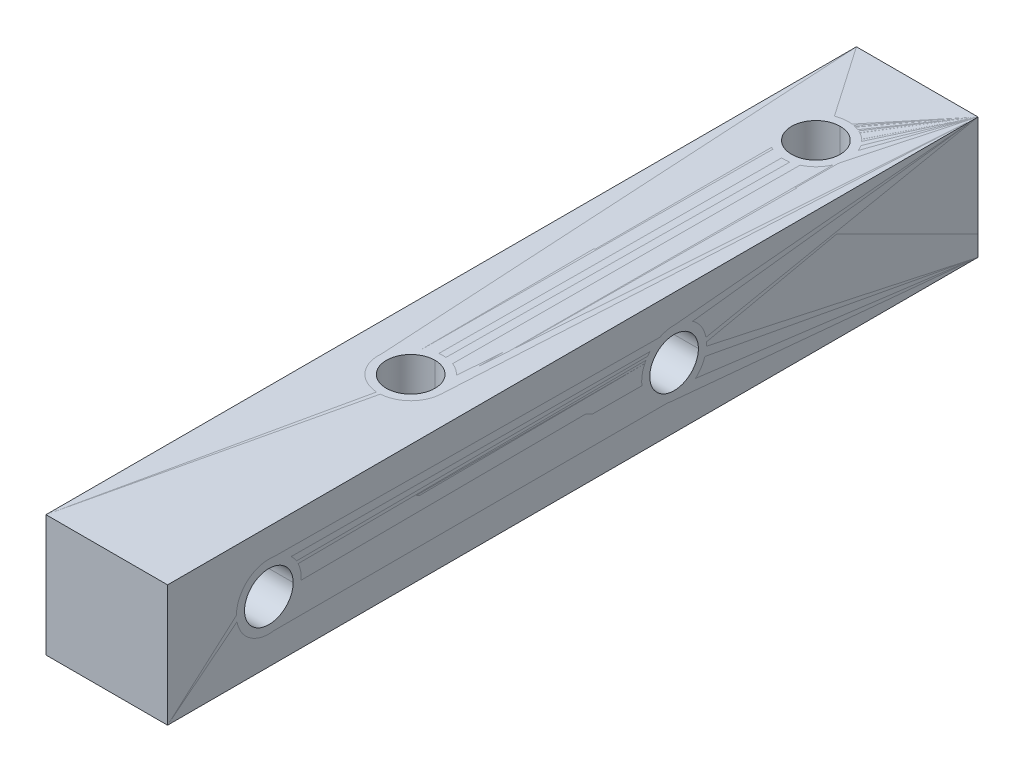
ISO-10303-21;
HEADER;
FILE_DESCRIPTION(('STEP AP214'),'2;1');
FILE_NAME('part.step','',(''),(''),'','','');
FILE_SCHEMA(('AUTOMOTIVE_DESIGN { 1 0 10303 214 1 1 1 1 }'));
ENDSEC;
DATA;
#1=APPLICATION_CONTEXT('core data for automotive mechanical design processes');
#2=APPLICATION_PROTOCOL_DEFINITION('international standard','automotive_design',2000,#1);
#3=PRODUCT_CONTEXT('',#1,'mechanical');
#4=PRODUCT('Part','Part','',(#3));
#5=PRODUCT_RELATED_PRODUCT_CATEGORY('part','',(#4));
#6=PRODUCT_DEFINITION_FORMATION('','',#4);
#7=PRODUCT_DEFINITION_CONTEXT('part definition',#1,'design');
#8=PRODUCT_DEFINITION('design','',#6,#7);
#9=PRODUCT_DEFINITION_SHAPE('','',#8);
#10=(LENGTH_UNIT() NAMED_UNIT(*) SI_UNIT(.MILLI.,.METRE.));
#11=(NAMED_UNIT(*) PLANE_ANGLE_UNIT() SI_UNIT($,.RADIAN.));
#12=(NAMED_UNIT(*) SI_UNIT($,.STERADIAN.) SOLID_ANGLE_UNIT());
#13=UNCERTAINTY_MEASURE_WITH_UNIT(LENGTH_MEASURE(1.E-05),#10,'distance_accuracy_value','');
#14=(GEOMETRIC_REPRESENTATION_CONTEXT(3) GLOBAL_UNCERTAINTY_ASSIGNED_CONTEXT((#13)) GLOBAL_UNIT_ASSIGNED_CONTEXT((#10,
#11,#12)) REPRESENTATION_CONTEXT('',''));
#15=CARTESIAN_POINT('',(0.,0.,0.));
#16=DIRECTION('',(0.,0.,1.));
#17=DIRECTION('',(1.,0.,0.));
#18=AXIS2_PLACEMENT_3D('',#15,#16,#17);
#19=CARTESIAN_POINT('',(0.,0.,40.));
#20=DIRECTION('',(0.,1.,0.));
#21=DIRECTION('',(1.,0.,0.));
#22=AXIS2_PLACEMENT_3D('',#19,#20,#21);
#23=PLANE('',#22);
#24=CARTESIAN_POINT('',(2.99999999999983,1.79051883554534E-13,24.9999999999994));
#25=DIRECTION('',(0.,-1.,0.));
#26=DIRECTION('',(0.,0.,-1.));
#27=AXIS2_PLACEMENT_3D('',#24,#25,#26);
#28=CIRCLE('',#27,1.59999999999999);
#29=CARTESIAN_POINT('',(2.99999999999983,1.79051883554534E-13,23.3999999999994));
#30=VERTEX_POINT('',#29);
#31=EDGE_CURVE('P0_E246',#30,#30,#28,.T.);
#32=ORIENTED_EDGE('',*,*,#31,.F.);
#33=EDGE_LOOP('',(#32));
#34=FACE_BOUND('',#33,.T.);
#35=DIRECTION('',(1.,0.,0.));
#36=VECTOR('',#35,1.);
#37=CARTESIAN_POINT('',(0.,0.,0.));
#38=LINE('',#37,#36);
#39=CARTESIAN_POINT('',(0.,0.,0.));
#40=VERTEX_POINT('',#39);
#41=CARTESIAN_POINT('',(6.,0.,0.));
#42=VERTEX_POINT('',#41);
#43=EDGE_CURVE('P0_E121',#40,#42,#38,.T.);
#44=ORIENTED_EDGE('',*,*,#43,.T.);
#45=DIRECTION('',(0.,0.,-1.));
#46=VECTOR('',#45,1.);
#47=CARTESIAN_POINT('',(6.,0.,40.));
#48=LINE('',#47,#46);
#49=CARTESIAN_POINT('',(6.,0.,40.));
#50=VERTEX_POINT('',#49);
#51=EDGE_CURVE('P0_E139',#50,#42,#48,.T.);
#52=ORIENTED_EDGE('',*,*,#51,.F.);
#53=DIRECTION('',(1.,0.,0.));
#54=VECTOR('',#53,1.);
#55=CARTESIAN_POINT('',(0.,0.,40.));
#56=LINE('',#55,#54);
#57=CARTESIAN_POINT('',(0.,0.,40.));
#58=VERTEX_POINT('',#57);
#59=EDGE_CURVE('P0_E84',#58,#50,#56,.T.);
#60=ORIENTED_EDGE('',*,*,#59,.F.);
#61=DIRECTION('',(0.,0.,-1.));
#62=VECTOR('',#61,1.);
#63=CARTESIAN_POINT('',(0.,0.,40.));
#64=LINE('',#63,#62);
#65=EDGE_CURVE('P0_E71',#58,#40,#64,.T.);
#66=ORIENTED_EDGE('',*,*,#65,.T.);
#67=EDGE_LOOP('',(#44,#52,#60,#66));
#68=FACE_BOUND('',#67,.T.);
#69=CARTESIAN_POINT('',(2.99999999999975,1.79051883554534E-13,4.99999999999936));
#70=DIRECTION('',(0.,-1.,0.));
#71=DIRECTION('',(0.,0.,-1.));
#72=AXIS2_PLACEMENT_3D('',#69,#70,#71);
#73=CIRCLE('',#72,1.59999999999999);
#74=CARTESIAN_POINT('',(2.99999999999975,1.79051883554534E-13,3.39999999999937));
#75=VERTEX_POINT('',#74);
#76=EDGE_CURVE('P0_E132',#75,#75,#73,.T.);
#77=ORIENTED_EDGE('',*,*,#76,.F.);
#78=EDGE_LOOP('',(#77));
#79=FACE_BOUND('',#78,.T.);
#80=ADVANCED_FACE('P0_F47',(#34,#68,#79),#23,.F.);
#81=CARTESIAN_POINT('',(0.,0.,40.));
#82=DIRECTION('',(1.,0.,0.));
#83=DIRECTION('',(0.,1.,0.));
#84=AXIS2_PLACEMENT_3D('',#81,#82,#83);
#85=PLANE('',#84);
#86=CARTESIAN_POINT('',(0.,2.99999999999914,34.9999999999992));
#87=DIRECTION('',(-1.,0.,0.));
#88=DIRECTION('',(0.,0.,1.));
#89=AXIS2_PLACEMENT_3D('',#86,#87,#88);
#90=CIRCLE('',#89,1.59999999999999);
#91=CARTESIAN_POINT('',(0.,2.99999999999914,36.5999999999991));
#92=VERTEX_POINT('',#91);
#93=EDGE_CURVE('P0_E237',#92,#92,#90,.T.);
#94=ORIENTED_EDGE('',*,*,#93,.F.);
#95=EDGE_LOOP('',(#94));
#96=FACE_BOUND('',#95,.T.);
#97=CARTESIAN_POINT('',(0.,2.99999999999914,14.9999999999991));
#98=DIRECTION('',(-1.,0.,0.));
#99=DIRECTION('',(0.,0.,1.));
#100=AXIS2_PLACEMENT_3D('',#97,#98,#99);
#101=CIRCLE('',#100,1.59999999999999);
#102=CARTESIAN_POINT('',(0.,2.99999999999914,16.5999999999991));
#103=VERTEX_POINT('',#102);
#104=EDGE_CURVE('P0_E236',#103,#103,#101,.T.);
#105=ORIENTED_EDGE('',*,*,#104,.F.);
#106=EDGE_LOOP('',(#105));
#107=FACE_BOUND('',#106,.T.);
#108=DIRECTION('',(0.,-1.,0.));
#109=VECTOR('',#108,1.);
#110=CARTESIAN_POINT('',(0.,0.,0.));
#111=LINE('',#110,#109);
#112=CARTESIAN_POINT('',(0.,6.,0.));
#113=VERTEX_POINT('',#112);
#114=EDGE_CURVE('P0_E11',#113,#40,#111,.T.);
#115=ORIENTED_EDGE('',*,*,#114,.T.);
#116=ORIENTED_EDGE('',*,*,#65,.F.);
#117=DIRECTION('',(0.,-1.,0.));
#118=VECTOR('',#117,1.);
#119=CARTESIAN_POINT('',(0.,0.,40.));
#120=LINE('',#119,#118);
#121=CARTESIAN_POINT('',(0.,6.,40.));
#122=VERTEX_POINT('',#121);
#123=EDGE_CURVE('P0_E108',#122,#58,#120,.T.);
#124=ORIENTED_EDGE('',*,*,#123,.F.);
#125=DIRECTION('',(0.,0.,-1.));
#126=VECTOR('',#125,1.);
#127=CARTESIAN_POINT('',(0.,6.,40.));
#128=LINE('',#127,#126);
#129=EDGE_CURVE('P0_E58',#122,#113,#128,.T.);
#130=ORIENTED_EDGE('',*,*,#129,.T.);
#131=EDGE_LOOP('',(#115,#116,#124,#130));
#132=FACE_BOUND('',#131,.T.);
#133=ADVANCED_FACE('P0_F112',(#96,#107,#132),#85,.F.);
#134=CARTESIAN_POINT('',(6.,0.,40.));
#135=DIRECTION('',(-1.,0.,0.));
#136=DIRECTION('',(0.,0.,1.));
#137=AXIS2_PLACEMENT_3D('',#134,#135,#136);
#138=PLANE('',#137);
#139=CARTESIAN_POINT('',(6.,2.99999999999914,34.9999999999992));
#140=DIRECTION('',(-1.,0.,0.));
#141=DIRECTION('',(0.,0.,1.));
#142=AXIS2_PLACEMENT_3D('',#139,#140,#141);
#143=CIRCLE('',#142,1.6);
#144=CARTESIAN_POINT('',(6.,2.99999999999914,36.5999999999992));
#145=VERTEX_POINT('',#144);
#146=EDGE_CURVE('P0_E233',#145,#145,#143,.T.);
#147=ORIENTED_EDGE('',*,*,#146,.T.);
#148=EDGE_LOOP('',(#147));
#149=FACE_BOUND('',#148,.T.);
#150=CARTESIAN_POINT('',(6.,2.99999999999914,14.9999999999991));
#151=DIRECTION('',(-1.,0.,0.));
#152=DIRECTION('',(0.,0.,1.));
#153=AXIS2_PLACEMENT_3D('',#150,#151,#152);
#154=CIRCLE('',#153,1.6);
#155=CARTESIAN_POINT('',(6.,2.99999999999914,16.5999999999991));
#156=VERTEX_POINT('',#155);
#157=EDGE_CURVE('P0_E242',#156,#156,#154,.T.);
#158=ORIENTED_EDGE('',*,*,#157,.T.);
#159=EDGE_LOOP('',(#158));
#160=FACE_BOUND('',#159,.T.);
#161=DIRECTION('',(0.,1.,0.));
#162=VECTOR('',#161,1.);
#163=CARTESIAN_POINT('',(6.,0.,0.));
#164=LINE('',#163,#162);
#165=CARTESIAN_POINT('',(6.,6.,0.));
#166=VERTEX_POINT('',#165);
#167=EDGE_CURVE('P0_E140',#42,#166,#164,.T.);
#168=ORIENTED_EDGE('',*,*,#167,.T.);
#169=DIRECTION('',(0.,0.,-1.));
#170=VECTOR('',#169,1.);
#171=CARTESIAN_POINT('',(6.,6.,40.));
#172=LINE('',#171,#170);
#173=CARTESIAN_POINT('',(6.,6.,40.));
#174=VERTEX_POINT('',#173);
#175=EDGE_CURVE('P0_E52',#174,#166,#172,.T.);
#176=ORIENTED_EDGE('',*,*,#175,.F.);
#177=DIRECTION('',(0.,1.,0.));
#178=VECTOR('',#177,1.);
#179=CARTESIAN_POINT('',(6.,0.,40.));
#180=LINE('',#179,#178);
#181=EDGE_CURVE('P0_E124',#50,#174,#180,.T.);
#182=ORIENTED_EDGE('',*,*,#181,.F.);
#183=ORIENTED_EDGE('',*,*,#51,.T.);
#184=EDGE_LOOP('',(#168,#176,#182,#183));
#185=FACE_BOUND('',#184,.T.);
#186=ADVANCED_FACE('P0_F162',(#149,#160,#185),#138,.F.);
#187=CARTESIAN_POINT('',(0.,6.,40.));
#188=DIRECTION('',(0.,-1.,0.));
#189=DIRECTION('',(0.,0.,-1.));
#190=AXIS2_PLACEMENT_3D('',#187,#188,#189);
#191=PLANE('',#190);
#192=CARTESIAN_POINT('',(2.99999999999983,6.,24.9999999999994));
#193=DIRECTION('',(0.,-1.,0.));
#194=DIRECTION('',(0.,0.,-1.));
#195=AXIS2_PLACEMENT_3D('',#192,#193,#194);
#196=CIRCLE('',#195,1.6);
#197=CARTESIAN_POINT('',(2.99999999999983,6.,23.3999999999994));
#198=VERTEX_POINT('',#197);
#199=EDGE_CURVE('P0_E247',#198,#198,#196,.T.);
#200=ORIENTED_EDGE('',*,*,#199,.T.);
#201=EDGE_LOOP('',(#200));
#202=FACE_BOUND('',#201,.T.);
#203=CARTESIAN_POINT('',(2.99999999999975,6.,4.99999999999936));
#204=DIRECTION('',(0.,-1.,0.));
#205=DIRECTION('',(0.,0.,-1.));
#206=AXIS2_PLACEMENT_3D('',#203,#204,#205);
#207=CIRCLE('',#206,1.6);
#208=CARTESIAN_POINT('',(2.99999999999975,6.,3.39999999999936));
#209=VERTEX_POINT('',#208);
#210=EDGE_CURVE('P0_E130',#209,#209,#207,.T.);
#211=ORIENTED_EDGE('',*,*,#210,.T.);
#212=EDGE_LOOP('',(#211));
#213=FACE_BOUND('',#212,.T.);
#214=DIRECTION('',(-1.,0.,0.));
#215=VECTOR('',#214,1.);
#216=CARTESIAN_POINT('',(0.,6.,0.));
#217=LINE('',#216,#215);
#218=EDGE_CURVE('P0_E118',#166,#113,#217,.T.);
#219=ORIENTED_EDGE('',*,*,#218,.T.);
#220=ORIENTED_EDGE('',*,*,#129,.F.);
#221=DIRECTION('',(-1.,0.,0.));
#222=VECTOR('',#221,1.);
#223=CARTESIAN_POINT('',(0.,6.,40.));
#224=LINE('',#223,#222);
#225=EDGE_CURVE('P0_E120',#174,#122,#224,.T.);
#226=ORIENTED_EDGE('',*,*,#225,.F.);
#227=ORIENTED_EDGE('',*,*,#175,.T.);
#228=EDGE_LOOP('',(#219,#220,#226,#227));
#229=FACE_BOUND('',#228,.T.);
#230=ADVANCED_FACE('P0_F116',(#202,#213,#229),#191,.F.);
#231=CARTESIAN_POINT('',(0.,0.,40.));
#232=DIRECTION('',(0.,0.,-1.));
#233=DIRECTION('',(0.,-1.,0.));
#234=AXIS2_PLACEMENT_3D('',#231,#232,#233);
#235=PLANE('',#234);
#236=ORIENTED_EDGE('',*,*,#123,.T.);
#237=ORIENTED_EDGE('',*,*,#59,.T.);
#238=ORIENTED_EDGE('',*,*,#181,.T.);
#239=ORIENTED_EDGE('',*,*,#225,.T.);
#240=EDGE_LOOP('',(#236,#237,#238,#239));
#241=FACE_BOUND('',#240,.T.);
#242=ADVANCED_FACE('P0_F123',(#241),#235,.F.);
#243=CARTESIAN_POINT('',(0.,0.,0.));
#244=DIRECTION('',(0.,0.,-1.));
#245=DIRECTION('',(0.,-1.,0.));
#246=AXIS2_PLACEMENT_3D('',#243,#244,#245);
#247=PLANE('',#246);
#248=ORIENTED_EDGE('',*,*,#114,.F.);
#249=ORIENTED_EDGE('',*,*,#218,.F.);
#250=ORIENTED_EDGE('',*,*,#167,.F.);
#251=ORIENTED_EDGE('',*,*,#43,.F.);
#252=EDGE_LOOP('',(#248,#249,#250,#251));
#253=FACE_BOUND('',#252,.T.);
#254=ADVANCED_FACE('P0_F51',(#253),#247,.T.);
#255=CARTESIAN_POINT('',(2.99999999999975,1.80411241501588E-13,4.99999999999936));
#256=DIRECTION('',(0.,-1.,0.));
#257=DIRECTION('',(0.,0.,-1.));
#258=AXIS2_PLACEMENT_3D('',#255,#256,#257);
#259=CYLINDRICAL_SURFACE('',#258,1.59999999999999);
#260=ORIENTED_EDGE('',*,*,#210,.F.);
#261=EDGE_LOOP('',(#260));
#262=FACE_BOUND('',#261,.T.);
#263=ORIENTED_EDGE('',*,*,#76,.T.);
#264=EDGE_LOOP('',(#263));
#265=FACE_BOUND('',#264,.T.);
#266=ADVANCED_FACE('P0_F183',(#262,#265),#259,.F.);
#267=CARTESIAN_POINT('',(2.99999999999983,1.80411241501588E-13,24.9999999999994));
#268=DIRECTION('',(0.,-1.,0.));
#269=DIRECTION('',(0.,0.,-1.));
#270=AXIS2_PLACEMENT_3D('',#267,#268,#269);
#271=CYLINDRICAL_SURFACE('',#270,1.59999999999999);
#272=ORIENTED_EDGE('',*,*,#199,.F.);
#273=EDGE_LOOP('',(#272));
#274=FACE_BOUND('',#273,.T.);
#275=ORIENTED_EDGE('',*,*,#31,.T.);
#276=EDGE_LOOP('',(#275));
#277=FACE_BOUND('',#276,.T.);
#278=ADVANCED_FACE('P0_F203',(#274,#277),#271,.F.);
#279=CARTESIAN_POINT('',(0.,2.99999999999914,14.9999999999991));
#280=DIRECTION('',(-1.,0.,0.));
#281=DIRECTION('',(0.,0.,1.));
#282=AXIS2_PLACEMENT_3D('',#279,#280,#281);
#283=CYLINDRICAL_SURFACE('',#282,1.59999999999999);
#284=ORIENTED_EDGE('',*,*,#157,.F.);
#285=EDGE_LOOP('',(#284));
#286=FACE_BOUND('',#285,.T.);
#287=ORIENTED_EDGE('',*,*,#104,.T.);
#288=EDGE_LOOP('',(#287));
#289=FACE_BOUND('',#288,.T.);
#290=ADVANCED_FACE('P0_F208',(#286,#289),#283,.F.);
#291=CARTESIAN_POINT('',(0.,2.99999999999914,34.9999999999992));
#292=DIRECTION('',(-1.,0.,0.));
#293=DIRECTION('',(0.,0.,1.));
#294=AXIS2_PLACEMENT_3D('',#291,#292,#293);
#295=CYLINDRICAL_SURFACE('',#294,1.59999999999999);
#296=ORIENTED_EDGE('',*,*,#146,.F.);
#297=EDGE_LOOP('',(#296));
#298=FACE_BOUND('',#297,.T.);
#299=ORIENTED_EDGE('',*,*,#93,.T.);
#300=EDGE_LOOP('',(#299));
#301=FACE_BOUND('',#300,.T.);
#302=ADVANCED_FACE('P0_F218',(#298,#301),#295,.F.);
#303=CLOSED_SHELL('',(#80,#133,#186,#230,#242,#254,#266,#278,#290,#302));
#304=MANIFOLD_SOLID_BREP('P0_B2',#303);
#305=CARTESIAN_POINT('',(50.,3.,35.));
#306=DIRECTION('',(-1.,0.,0.));
#307=DIRECTION('',(0.,0.,1.));
#308=AXIS2_PLACEMENT_3D('',#305,#306,#307);
#309=CYLINDRICAL_SURFACE('',#308,1.2);
#310=CARTESIAN_POINT('',(6.,3.,35.));
#311=DIRECTION('',(-1.,0.,0.));
#312=DIRECTION('',(0.,0.,1.));
#313=AXIS2_PLACEMENT_3D('',#310,#311,#312);
#314=CIRCLE('',#313,1.2);
#315=CARTESIAN_POINT('',(6.,3.,33.8));
#316=VERTEX_POINT('',#315);
#317=CARTESIAN_POINT('',(6.,3.,36.2));
#318=VERTEX_POINT('',#317);
#319=EDGE_CURVE('P1_E37',#316,#318,#314,.T.);
#320=ORIENTED_EDGE('',*,*,#319,.F.);
#321=DIRECTION('',(-1.,0.,0.));
#322=VECTOR('',#321,1.);
#323=CARTESIAN_POINT('',(50.,3.,33.8));
#324=LINE('',#323,#322);
#325=CARTESIAN_POINT('',(0.,3.,33.8));
#326=VERTEX_POINT('',#325);
#327=EDGE_CURVE('P1_E11',#316,#326,#324,.T.);
#328=ORIENTED_EDGE('',*,*,#327,.T.);
#329=CARTESIAN_POINT('',(0.,3.,35.));
#330=DIRECTION('',(-1.,0.,0.));
#331=DIRECTION('',(0.,0.,1.));
#332=AXIS2_PLACEMENT_3D('',#329,#330,#331);
#333=CIRCLE('',#332,1.2);
#334=CARTESIAN_POINT('',(0.,3.,36.2));
#335=VERTEX_POINT('',#334);
#336=EDGE_CURVE('P1_E30',#326,#335,#333,.T.);
#337=ORIENTED_EDGE('',*,*,#336,.T.);
#338=DIRECTION('',(-1.,0.,0.));
#339=VECTOR('',#338,1.);
#340=CARTESIAN_POINT('',(50.,3.,36.2));
#341=LINE('',#340,#339);
#342=EDGE_CURVE('P1_E129',#318,#335,#341,.T.);
#343=ORIENTED_EDGE('',*,*,#342,.F.);
#344=EDGE_LOOP('',(#320,#328,#337,#343));
#345=FACE_BOUND('',#344,.T.);
#346=ADVANCED_FACE('P1_F16',(#345),#309,.F.);
#347=CARTESIAN_POINT('',(50.,3.,15.));
#348=DIRECTION('',(-1.,0.,0.));
#349=DIRECTION('',(0.,0.,1.));
#350=AXIS2_PLACEMENT_3D('',#347,#348,#349);
#351=CYLINDRICAL_SURFACE('',#350,1.2);
#352=CARTESIAN_POINT('',(6.,3.,15.));
#353=DIRECTION('',(-1.,0.,0.));
#354=DIRECTION('',(0.,0.,1.));
#355=AXIS2_PLACEMENT_3D('',#352,#353,#354);
#356=CIRCLE('',#355,1.2);
#357=CARTESIAN_POINT('',(6.,3.,13.8));
#358=VERTEX_POINT('',#357);
#359=CARTESIAN_POINT('',(6.,3.,16.2));
#360=VERTEX_POINT('',#359);
#361=EDGE_CURVE('P1_E20',#358,#360,#356,.T.);
#362=ORIENTED_EDGE('',*,*,#361,.F.);
#363=DIRECTION('',(-1.,0.,0.));
#364=VECTOR('',#363,1.);
#365=CARTESIAN_POINT('',(50.,3.,13.8));
#366=LINE('',#365,#364);
#367=CARTESIAN_POINT('',(0.,3.,13.8));
#368=VERTEX_POINT('',#367);
#369=EDGE_CURVE('P1_E116',#358,#368,#366,.T.);
#370=ORIENTED_EDGE('',*,*,#369,.T.);
#371=CARTESIAN_POINT('',(0.,3.,15.));
#372=DIRECTION('',(-1.,0.,0.));
#373=DIRECTION('',(0.,0.,1.));
#374=AXIS2_PLACEMENT_3D('',#371,#372,#373);
#375=CIRCLE('',#374,1.2);
#376=CARTESIAN_POINT('',(0.,3.,16.2));
#377=VERTEX_POINT('',#376);
#378=EDGE_CURVE('P1_E108',#368,#377,#375,.T.);
#379=ORIENTED_EDGE('',*,*,#378,.T.);
#380=DIRECTION('',(-1.,0.,0.));
#381=VECTOR('',#380,1.);
#382=CARTESIAN_POINT('',(50.,3.,16.2));
#383=LINE('',#382,#381);
#384=EDGE_CURVE('P1_E128',#360,#377,#383,.T.);
#385=ORIENTED_EDGE('',*,*,#384,.F.);
#386=EDGE_LOOP('',(#362,#370,#379,#385));
#387=FACE_BOUND('',#386,.T.);
#388=ADVANCED_FACE('P1_F120',(#387),#351,.F.);
#389=CARTESIAN_POINT('',(3.,-44.,5.));
#390=DIRECTION('',(0.,1.,0.));
#391=DIRECTION('',(0.,0.,1.));
#392=AXIS2_PLACEMENT_3D('',#389,#390,#391);
#393=CYLINDRICAL_SURFACE('',#392,1.2);
#394=CARTESIAN_POINT('',(3.,0.,5.));
#395=DIRECTION('',(0.,1.,0.));
#396=DIRECTION('',(0.,0.,1.));
#397=AXIS2_PLACEMENT_3D('',#394,#395,#396);
#398=CIRCLE('',#397,1.2);
#399=CARTESIAN_POINT('',(3.,0.,3.8));
#400=VERTEX_POINT('',#399);
#401=CARTESIAN_POINT('',(3.,0.,6.2));
#402=VERTEX_POINT('',#401);
#403=EDGE_CURVE('P1_E160',#400,#402,#398,.T.);
#404=ORIENTED_EDGE('',*,*,#403,.F.);
#405=DIRECTION('',(0.,1.,0.));
#406=VECTOR('',#405,1.);
#407=CARTESIAN_POINT('',(3.,-44.,3.8));
#408=LINE('',#407,#406);
#409=CARTESIAN_POINT('',(3.,6.,3.8));
#410=VERTEX_POINT('',#409);
#411=EDGE_CURVE('P1_E117',#400,#410,#408,.T.);
#412=ORIENTED_EDGE('',*,*,#411,.T.);
#413=CARTESIAN_POINT('',(3.,6.,5.));
#414=DIRECTION('',(0.,1.,0.));
#415=DIRECTION('',(0.,0.,1.));
#416=AXIS2_PLACEMENT_3D('',#413,#414,#415);
#417=CIRCLE('',#416,1.2);
#418=CARTESIAN_POINT('',(3.,6.,6.2));
#419=VERTEX_POINT('',#418);
#420=EDGE_CURVE('P1_E155',#410,#419,#417,.T.);
#421=ORIENTED_EDGE('',*,*,#420,.T.);
#422=DIRECTION('',(0.,1.,0.));
#423=VECTOR('',#422,1.);
#424=CARTESIAN_POINT('',(3.,-44.,6.2));
#425=LINE('',#424,#423);
#426=EDGE_CURVE('P1_E190',#402,#419,#425,.T.);
#427=ORIENTED_EDGE('',*,*,#426,.F.);
#428=EDGE_LOOP('',(#404,#412,#421,#427));
#429=FACE_BOUND('',#428,.T.);
#430=ADVANCED_FACE('P1_F276',(#429),#393,.F.);
#431=CARTESIAN_POINT('',(3.,-44.,25.));
#432=DIRECTION('',(0.,1.,0.));
#433=DIRECTION('',(0.,0.,1.));
#434=AXIS2_PLACEMENT_3D('',#431,#432,#433);
#435=CYLINDRICAL_SURFACE('',#434,1.2);
#436=CARTESIAN_POINT('',(3.,0.,25.));
#437=DIRECTION('',(0.,1.,0.));
#438=DIRECTION('',(0.,0.,1.));
#439=AXIS2_PLACEMENT_3D('',#436,#437,#438);
#440=CIRCLE('',#439,1.2);
#441=CARTESIAN_POINT('',(3.,0.,23.8));
#442=VERTEX_POINT('',#441);
#443=CARTESIAN_POINT('',(3.,0.,26.2));
#444=VERTEX_POINT('',#443);
#445=EDGE_CURVE('P1_E158',#442,#444,#440,.T.);
#446=ORIENTED_EDGE('',*,*,#445,.F.);
#447=DIRECTION('',(0.,1.,0.));
#448=VECTOR('',#447,1.);
#449=CARTESIAN_POINT('',(3.,-44.,23.8));
#450=LINE('',#449,#448);
#451=CARTESIAN_POINT('',(3.,6.,23.8));
#452=VERTEX_POINT('',#451);
#453=EDGE_CURVE('P1_E170',#442,#452,#450,.T.);
#454=ORIENTED_EDGE('',*,*,#453,.T.);
#455=CARTESIAN_POINT('',(3.,6.,25.));
#456=DIRECTION('',(0.,1.,0.));
#457=DIRECTION('',(0.,0.,1.));
#458=AXIS2_PLACEMENT_3D('',#455,#456,#457);
#459=CIRCLE('',#458,1.2);
#460=CARTESIAN_POINT('',(3.,6.,26.2));
#461=VERTEX_POINT('',#460);
#462=EDGE_CURVE('P1_E163',#452,#461,#459,.T.);
#463=ORIENTED_EDGE('',*,*,#462,.T.);
#464=DIRECTION('',(0.,1.,0.));
#465=VECTOR('',#464,1.);
#466=CARTESIAN_POINT('',(3.,-44.,26.2));
#467=LINE('',#466,#465);
#468=EDGE_CURVE('P1_E175',#444,#461,#467,.T.);
#469=ORIENTED_EDGE('',*,*,#468,.F.);
#470=EDGE_LOOP('',(#446,#454,#463,#469));
#471=FACE_BOUND('',#470,.T.);
#472=ADVANCED_FACE('P1_F267',(#471),#435,.F.);
#473=CARTESIAN_POINT('',(0.,0.,40.));
#474=DIRECTION('',(1.,0.,0.));
#475=DIRECTION('',(0.,1.,0.));
#476=AXIS2_PLACEMENT_3D('',#473,#474,#475);
#477=PLANE('',#476);
#478=DIRECTION('',(0.,-1.,0.));
#479=VECTOR('',#478,1.);
#480=CARTESIAN_POINT('',(0.,0.,0.));
#481=LINE('',#480,#479);
#482=CARTESIAN_POINT('',(0.,6.,0.));
#483=VERTEX_POINT('',#482);
#484=CARTESIAN_POINT('',(0.,0.,0.));
#485=VERTEX_POINT('',#484);
#486=EDGE_CURVE('P1_E169',#483,#485,#481,.T.);
#487=ORIENTED_EDGE('',*,*,#486,.T.);
#488=DIRECTION('',(0.,0.,-1.));
#489=VECTOR('',#488,1.);
#490=CARTESIAN_POINT('',(0.,0.,40.));
#491=LINE('',#490,#489);
#492=CARTESIAN_POINT('',(0.,0.,40.));
#493=VERTEX_POINT('',#492);
#494=EDGE_CURVE('P1_E144',#493,#485,#491,.T.);
#495=ORIENTED_EDGE('',*,*,#494,.F.);
#496=DIRECTION('',(0.,-1.,0.));
#497=VECTOR('',#496,1.);
#498=CARTESIAN_POINT('',(0.,0.,40.));
#499=LINE('',#498,#497);
#500=CARTESIAN_POINT('',(0.,6.,40.));
#501=VERTEX_POINT('',#500);
#502=EDGE_CURVE('P1_E191',#501,#493,#499,.T.);
#503=ORIENTED_EDGE('',*,*,#502,.F.);
#504=DIRECTION('',(0.,0.,-1.));
#505=VECTOR('',#504,1.);
#506=CARTESIAN_POINT('',(0.,6.,40.));
#507=LINE('',#506,#505);
#508=EDGE_CURVE('P1_E173',#501,#483,#507,.T.);
#509=ORIENTED_EDGE('',*,*,#508,.T.);
#510=EDGE_LOOP('',(#487,#495,#503,#509));
#511=FACE_BOUND('',#510,.T.);
#512=CARTESIAN_POINT('',(0.,3.,35.));
#513=DIRECTION('',(-1.,0.,0.));
#514=DIRECTION('',(0.,0.,1.));
#515=AXIS2_PLACEMENT_3D('',#512,#513,#514);
#516=CIRCLE('',#515,1.2);
#517=EDGE_CURVE('P1_E143',#335,#326,#516,.T.);
#518=ORIENTED_EDGE('',*,*,#517,.F.);
#519=ORIENTED_EDGE('',*,*,#336,.F.);
#520=EDGE_LOOP('',(#518,#519));
#521=FACE_BOUND('',#520,.T.);
#522=CARTESIAN_POINT('',(0.,3.,15.));
#523=DIRECTION('',(-1.,0.,0.));
#524=DIRECTION('',(0.,0.,1.));
#525=AXIS2_PLACEMENT_3D('',#522,#523,#524);
#526=CIRCLE('',#525,1.2);
#527=EDGE_CURVE('P1_E114',#377,#368,#526,.T.);
#528=ORIENTED_EDGE('',*,*,#527,.F.);
#529=ORIENTED_EDGE('',*,*,#378,.F.);
#530=EDGE_LOOP('',(#528,#529));
#531=FACE_BOUND('',#530,.T.);
#532=ADVANCED_FACE('P1_F112',(#511,#521,#531),#477,.F.);
#533=CARTESIAN_POINT('',(0.,0.,40.));
#534=DIRECTION('',(0.,1.,0.));
#535=DIRECTION('',(1.,0.,0.));
#536=AXIS2_PLACEMENT_3D('',#533,#534,#535);
#537=PLANE('',#536);
#538=DIRECTION('',(1.,0.,0.));
#539=VECTOR('',#538,1.);
#540=CARTESIAN_POINT('',(0.,0.,0.));
#541=LINE('',#540,#539);
#542=CARTESIAN_POINT('',(6.,0.,0.));
#543=VERTEX_POINT('',#542);
#544=EDGE_CURVE('P1_E168',#485,#543,#541,.T.);
#545=ORIENTED_EDGE('',*,*,#544,.T.);
#546=DIRECTION('',(0.,0.,-1.));
#547=VECTOR('',#546,1.);
#548=CARTESIAN_POINT('',(6.,0.,40.));
#549=LINE('',#548,#547);
#550=CARTESIAN_POINT('',(6.,0.,40.));
#551=VERTEX_POINT('',#550);
#552=EDGE_CURVE('P1_E162',#551,#543,#549,.T.);
#553=ORIENTED_EDGE('',*,*,#552,.F.);
#554=DIRECTION('',(1.,0.,0.));
#555=VECTOR('',#554,1.);
#556=CARTESIAN_POINT('',(0.,0.,40.));
#557=LINE('',#556,#555);
#558=EDGE_CURVE('P1_E192',#493,#551,#557,.T.);
#559=ORIENTED_EDGE('',*,*,#558,.F.);
#560=ORIENTED_EDGE('',*,*,#494,.T.);
#561=EDGE_LOOP('',(#545,#553,#559,#560));
#562=FACE_BOUND('',#561,.T.);
#563=CARTESIAN_POINT('',(3.,0.,5.));
#564=DIRECTION('',(0.,1.,0.));
#565=DIRECTION('',(0.,0.,1.));
#566=AXIS2_PLACEMENT_3D('',#563,#564,#565);
#567=CIRCLE('',#566,1.2);
#568=EDGE_CURVE('P1_E205',#402,#400,#567,.T.);
#569=ORIENTED_EDGE('',*,*,#568,.T.);
#570=ORIENTED_EDGE('',*,*,#403,.T.);
#571=EDGE_LOOP('',(#569,#570));
#572=FACE_BOUND('',#571,.T.);
#573=CARTESIAN_POINT('',(3.,0.,25.));
#574=DIRECTION('',(0.,1.,0.));
#575=DIRECTION('',(0.,0.,1.));
#576=AXIS2_PLACEMENT_3D('',#573,#574,#575);
#577=CIRCLE('',#576,1.2);
#578=EDGE_CURVE('P1_E153',#444,#442,#577,.T.);
#579=ORIENTED_EDGE('',*,*,#578,.T.);
#580=ORIENTED_EDGE('',*,*,#445,.T.);
#581=EDGE_LOOP('',(#579,#580));
#582=FACE_BOUND('',#581,.T.);
#583=ADVANCED_FACE('P1_F268',(#562,#572,#582),#537,.F.);
#584=CARTESIAN_POINT('',(6.,0.,40.));
#585=DIRECTION('',(-1.,0.,0.));
#586=DIRECTION('',(0.,0.,1.));
#587=AXIS2_PLACEMENT_3D('',#584,#585,#586);
#588=PLANE('',#587);
#589=DIRECTION('',(0.,1.,0.));
#590=VECTOR('',#589,1.);
#591=CARTESIAN_POINT('',(6.,0.,0.));
#592=LINE('',#591,#590);
#593=CARTESIAN_POINT('',(6.,6.,0.));
#594=VERTEX_POINT('',#593);
#595=EDGE_CURVE('P1_E208',#543,#594,#592,.T.);
#596=ORIENTED_EDGE('',*,*,#595,.T.);
#597=DIRECTION('',(0.,0.,-1.));
#598=VECTOR('',#597,1.);
#599=CARTESIAN_POINT('',(6.,6.,40.));
#600=LINE('',#599,#598);
#601=CARTESIAN_POINT('',(6.,6.,40.));
#602=VERTEX_POINT('',#601);
#603=EDGE_CURVE('P1_E225',#602,#594,#600,.T.);
#604=ORIENTED_EDGE('',*,*,#603,.F.);
#605=DIRECTION('',(0.,1.,0.));
#606=VECTOR('',#605,1.);
#607=CARTESIAN_POINT('',(6.,0.,40.));
#608=LINE('',#607,#606);
#609=EDGE_CURVE('P1_E193',#551,#602,#608,.T.);
#610=ORIENTED_EDGE('',*,*,#609,.F.);
#611=ORIENTED_EDGE('',*,*,#552,.T.);
#612=EDGE_LOOP('',(#596,#604,#610,#611));
#613=FACE_BOUND('',#612,.T.);
#614=CARTESIAN_POINT('',(6.,3.,35.));
#615=DIRECTION('',(-1.,0.,0.));
#616=DIRECTION('',(0.,0.,1.));
#617=AXIS2_PLACEMENT_3D('',#614,#615,#616);
#618=CIRCLE('',#617,1.2);
#619=EDGE_CURVE('P1_E157',#318,#316,#618,.T.);
#620=ORIENTED_EDGE('',*,*,#619,.T.);
#621=ORIENTED_EDGE('',*,*,#319,.T.);
#622=EDGE_LOOP('',(#620,#621));
#623=FACE_BOUND('',#622,.T.);
#624=CARTESIAN_POINT('',(6.,3.,15.));
#625=DIRECTION('',(-1.,0.,0.));
#626=DIRECTION('',(0.,0.,1.));
#627=AXIS2_PLACEMENT_3D('',#624,#625,#626);
#628=CIRCLE('',#627,1.2);
#629=EDGE_CURVE('P1_E209',#360,#358,#628,.T.);
#630=ORIENTED_EDGE('',*,*,#629,.T.);
#631=ORIENTED_EDGE('',*,*,#361,.T.);
#632=EDGE_LOOP('',(#630,#631));
#633=FACE_BOUND('',#632,.T.);
#634=ADVANCED_FACE('P1_F259',(#613,#623,#633),#588,.F.);
#635=CARTESIAN_POINT('',(0.,6.,40.));
#636=DIRECTION('',(0.,-1.,0.));
#637=DIRECTION('',(0.,0.,-1.));
#638=AXIS2_PLACEMENT_3D('',#635,#636,#637);
#639=PLANE('',#638);
#640=DIRECTION('',(-1.,0.,0.));
#641=VECTOR('',#640,1.);
#642=CARTESIAN_POINT('',(0.,6.,0.));
#643=LINE('',#642,#641);
#644=EDGE_CURVE('P1_E218',#594,#483,#643,.T.);
#645=ORIENTED_EDGE('',*,*,#644,.T.);
#646=ORIENTED_EDGE('',*,*,#508,.F.);
#647=DIRECTION('',(-1.,0.,0.));
#648=VECTOR('',#647,1.);
#649=CARTESIAN_POINT('',(0.,6.,40.));
#650=LINE('',#649,#648);
#651=EDGE_CURVE('P1_E176',#602,#501,#650,.T.);
#652=ORIENTED_EDGE('',*,*,#651,.F.);
#653=ORIENTED_EDGE('',*,*,#603,.T.);
#654=EDGE_LOOP('',(#645,#646,#652,#653));
#655=FACE_BOUND('',#654,.T.);
#656=CARTESIAN_POINT('',(3.,6.,5.));
#657=DIRECTION('',(0.,1.,0.));
#658=DIRECTION('',(0.,0.,1.));
#659=AXIS2_PLACEMENT_3D('',#656,#657,#658);
#660=CIRCLE('',#659,1.2);
#661=EDGE_CURVE('P1_E140',#419,#410,#660,.T.);
#662=ORIENTED_EDGE('',*,*,#661,.F.);
#663=ORIENTED_EDGE('',*,*,#420,.F.);
#664=EDGE_LOOP('',(#662,#663));
#665=FACE_BOUND('',#664,.T.);
#666=CARTESIAN_POINT('',(3.,6.,25.));
#667=DIRECTION('',(0.,1.,0.));
#668=DIRECTION('',(0.,0.,1.));
#669=AXIS2_PLACEMENT_3D('',#666,#667,#668);
#670=CIRCLE('',#669,1.2);
#671=EDGE_CURVE('P1_E178',#461,#452,#670,.T.);
#672=ORIENTED_EDGE('',*,*,#671,.F.);
#673=ORIENTED_EDGE('',*,*,#462,.F.);
#674=EDGE_LOOP('',(#672,#673));
#675=FACE_BOUND('',#674,.T.);
#676=ADVANCED_FACE('P1_F291',(#655,#665,#675),#639,.F.);
#677=CARTESIAN_POINT('',(0.,0.,40.));
#678=DIRECTION('',(0.,0.,-1.));
#679=DIRECTION('',(0.,-1.,0.));
#680=AXIS2_PLACEMENT_3D('',#677,#678,#679);
#681=PLANE('',#680);
#682=ORIENTED_EDGE('',*,*,#502,.T.);
#683=ORIENTED_EDGE('',*,*,#558,.T.);
#684=ORIENTED_EDGE('',*,*,#609,.T.);
#685=ORIENTED_EDGE('',*,*,#651,.T.);
#686=EDGE_LOOP('',(#682,#683,#684,#685));
#687=FACE_BOUND('',#686,.T.);
#688=ADVANCED_FACE('P1_F294',(#687),#681,.F.);
#689=CARTESIAN_POINT('',(0.,0.,0.));
#690=DIRECTION('',(0.,0.,-1.));
#691=DIRECTION('',(0.,-1.,0.));
#692=AXIS2_PLACEMENT_3D('',#689,#690,#691);
#693=PLANE('',#692);
#694=ORIENTED_EDGE('',*,*,#486,.F.);
#695=ORIENTED_EDGE('',*,*,#644,.F.);
#696=ORIENTED_EDGE('',*,*,#595,.F.);
#697=ORIENTED_EDGE('',*,*,#544,.F.);
#698=EDGE_LOOP('',(#694,#695,#696,#697));
#699=FACE_BOUND('',#698,.T.);
#700=ADVANCED_FACE('P1_F304',(#699),#693,.T.);
#701=CARTESIAN_POINT('',(3.,-44.,25.));
#702=DIRECTION('',(0.,1.,0.));
#703=DIRECTION('',(0.,0.,1.));
#704=AXIS2_PLACEMENT_3D('',#701,#702,#703);
#705=CYLINDRICAL_SURFACE('',#704,1.2);
#706=ORIENTED_EDGE('',*,*,#453,.F.);
#707=ORIENTED_EDGE('',*,*,#578,.F.);
#708=ORIENTED_EDGE('',*,*,#468,.T.);
#709=ORIENTED_EDGE('',*,*,#671,.T.);
#710=EDGE_LOOP('',(#706,#707,#708,#709));
#711=FACE_BOUND('',#710,.T.);
#712=ADVANCED_FACE('P1_F18',(#711),#705,.F.);
#713=CARTESIAN_POINT('',(3.,-44.,5.));
#714=DIRECTION('',(0.,1.,0.));
#715=DIRECTION('',(0.,0.,1.));
#716=AXIS2_PLACEMENT_3D('',#713,#714,#715);
#717=CYLINDRICAL_SURFACE('',#716,1.2);
#718=ORIENTED_EDGE('',*,*,#411,.F.);
#719=ORIENTED_EDGE('',*,*,#568,.F.);
#720=ORIENTED_EDGE('',*,*,#426,.T.);
#721=ORIENTED_EDGE('',*,*,#661,.T.);
#722=EDGE_LOOP('',(#718,#719,#720,#721));
#723=FACE_BOUND('',#722,.T.);
#724=ADVANCED_FACE('P1_F295',(#723),#717,.F.);
#725=CARTESIAN_POINT('',(50.,3.,15.));
#726=DIRECTION('',(-1.,0.,0.));
#727=DIRECTION('',(0.,0.,1.));
#728=AXIS2_PLACEMENT_3D('',#725,#726,#727);
#729=CYLINDRICAL_SURFACE('',#728,1.2);
#730=ORIENTED_EDGE('',*,*,#369,.F.);
#731=ORIENTED_EDGE('',*,*,#629,.F.);
#732=ORIENTED_EDGE('',*,*,#384,.T.);
#733=ORIENTED_EDGE('',*,*,#527,.T.);
#734=EDGE_LOOP('',(#730,#731,#732,#733));
#735=FACE_BOUND('',#734,.T.);
#736=ADVANCED_FACE('P1_F126',(#735),#729,.F.);
#737=CARTESIAN_POINT('',(50.,3.,35.));
#738=DIRECTION('',(-1.,0.,0.));
#739=DIRECTION('',(0.,0.,1.));
#740=AXIS2_PLACEMENT_3D('',#737,#738,#739);
#741=CYLINDRICAL_SURFACE('',#740,1.2);
#742=ORIENTED_EDGE('',*,*,#327,.F.);
#743=ORIENTED_EDGE('',*,*,#619,.F.);
#744=ORIENTED_EDGE('',*,*,#342,.T.);
#745=ORIENTED_EDGE('',*,*,#517,.T.);
#746=EDGE_LOOP('',(#742,#743,#744,#745));
#747=FACE_BOUND('',#746,.T.);
#748=ADVANCED_FACE('P1_F265',(#747),#741,.F.);
#749=CLOSED_SHELL('',(#346,#388,#430,#472,#532,#583,#634,#676,#688,#700,#712,#724,#736,#748));
#750=MANIFOLD_SOLID_BREP('P1_B1',#749);
#751=ADVANCED_BREP_SHAPE_REPRESENTATION('',(#18,#304,#750),#14);
#752=SHAPE_DEFINITION_REPRESENTATION(#9,#751);
ENDSEC;
END-ISO-10303-21;
